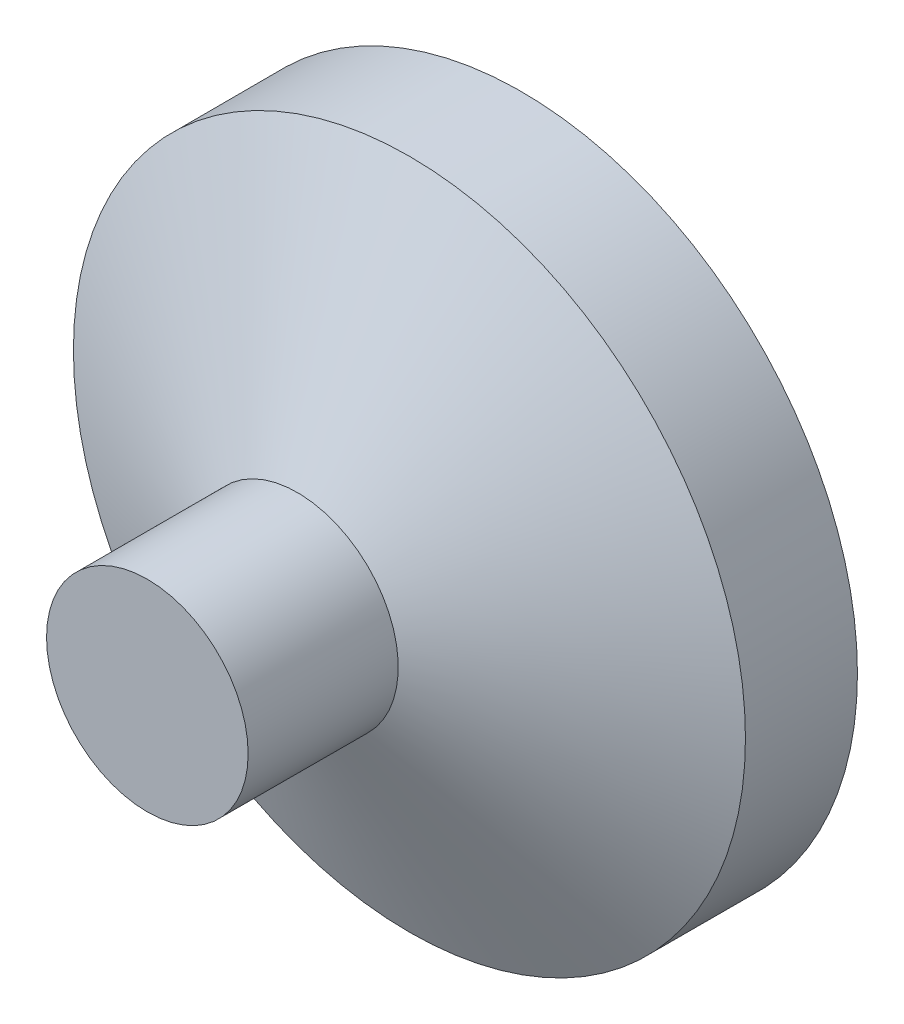
ISO-10303-21;
HEADER;
FILE_DESCRIPTION(('STEP AP214'),'2;1');
FILE_NAME('part.step','',(''),(''),'','','');
FILE_SCHEMA(('AUTOMOTIVE_DESIGN { 1 0 10303 214 1 1 1 1 }'));
ENDSEC;
DATA;
#1=APPLICATION_CONTEXT('core data for automotive mechanical design processes');
#2=APPLICATION_PROTOCOL_DEFINITION('international standard','automotive_design',2000,#1);
#3=PRODUCT_CONTEXT('',#1,'mechanical');
#4=PRODUCT('Part','Part','',(#3));
#5=PRODUCT_RELATED_PRODUCT_CATEGORY('part','',(#4));
#6=PRODUCT_DEFINITION_FORMATION('','',#4);
#7=PRODUCT_DEFINITION_CONTEXT('part definition',#1,'design');
#8=PRODUCT_DEFINITION('design','',#6,#7);
#9=PRODUCT_DEFINITION_SHAPE('','',#8);
#10=(LENGTH_UNIT() NAMED_UNIT(*) SI_UNIT(.MILLI.,.METRE.));
#11=(NAMED_UNIT(*) PLANE_ANGLE_UNIT() SI_UNIT($,.RADIAN.));
#12=(NAMED_UNIT(*) SI_UNIT($,.STERADIAN.) SOLID_ANGLE_UNIT());
#13=UNCERTAINTY_MEASURE_WITH_UNIT(LENGTH_MEASURE(1.E-05),#10,'distance_accuracy_value','');
#14=(GEOMETRIC_REPRESENTATION_CONTEXT(3) GLOBAL_UNCERTAINTY_ASSIGNED_CONTEXT((#13)) GLOBAL_UNIT_ASSIGNED_CONTEXT((#10,
#11,#12)) REPRESENTATION_CONTEXT('',''));
#15=CARTESIAN_POINT('',(0.,0.,0.));
#16=DIRECTION('',(0.,0.,1.));
#17=DIRECTION('',(1.,0.,0.));
#18=AXIS2_PLACEMENT_3D('',#15,#16,#17);
#19=CARTESIAN_POINT('',(0.,0.,-5.));
#20=DIRECTION('',(0.,0.,1.));
#21=DIRECTION('',(1.,0.,0.));
#22=AXIS2_PLACEMENT_3D('',#19,#20,#21);
#23=CYLINDRICAL_SURFACE('',#22,15.);
#24=CARTESIAN_POINT('',(0.,0.,-5.));
#25=DIRECTION('',(0.,0.,1.));
#26=DIRECTION('',(1.,0.,0.));
#27=AXIS2_PLACEMENT_3D('',#24,#25,#26);
#28=CIRCLE('',#27,15.);
#29=CARTESIAN_POINT('',(15.,0.,-5.));
#30=VERTEX_POINT('',#29);
#31=EDGE_CURVE('E11',#30,#30,#28,.T.);
#32=ORIENTED_EDGE('',*,*,#31,.T.);
#33=EDGE_LOOP('',(#32));
#34=FACE_BOUND('',#33,.T.);
#35=CARTESIAN_POINT('',(0.,0.,0.));
#36=DIRECTION('',(0.,0.,-1.));
#37=DIRECTION('',(-1.,0.,0.));
#38=AXIS2_PLACEMENT_3D('',#35,#36,#37);
#39=CIRCLE('',#38,15.);
#40=CARTESIAN_POINT('',(-15.,0.,0.));
#41=VERTEX_POINT('',#40);
#42=EDGE_CURVE('E44',#41,#41,#39,.F.);
#43=ORIENTED_EDGE('',*,*,#42,.F.);
#44=EDGE_LOOP('',(#43));
#45=FACE_BOUND('',#44,.T.);
#46=ADVANCED_FACE('F36',(#34,#45),#23,.T.);
#47=CARTESIAN_POINT('',(0.,0.,-5.));
#48=DIRECTION('',(0.,0.,1.));
#49=DIRECTION('',(1.,0.,0.));
#50=AXIS2_PLACEMENT_3D('',#47,#48,#49);
#51=PLANE('',#50);
#52=CARTESIAN_POINT('',(-8.66025403784439,-5.,-5.));
#53=DIRECTION('',(0.,0.,1.));
#54=DIRECTION('',(1.,0.,0.));
#55=AXIS2_PLACEMENT_3D('',#52,#53,#54);
#56=CIRCLE('',#55,1.);
#57=CARTESIAN_POINT('',(-7.66025403784438,-5.,-5.));
#58=VERTEX_POINT('',#57);
#59=EDGE_CURVE('E91',#58,#58,#56,.T.);
#60=ORIENTED_EDGE('',*,*,#59,.T.);
#61=EDGE_LOOP('',(#60));
#62=FACE_BOUND('',#61,.T.);
#63=CARTESIAN_POINT('',(8.66025403784439,-5.,-5.));
#64=DIRECTION('',(0.,0.,1.));
#65=DIRECTION('',(1.,0.,0.));
#66=AXIS2_PLACEMENT_3D('',#63,#64,#65);
#67=CIRCLE('',#66,1.);
#68=CARTESIAN_POINT('',(9.66025403784439,-5.,-5.));
#69=VERTEX_POINT('',#68);
#70=EDGE_CURVE('E101',#69,#69,#67,.T.);
#71=ORIENTED_EDGE('',*,*,#70,.T.);
#72=EDGE_LOOP('',(#71));
#73=FACE_BOUND('',#72,.T.);
#74=CARTESIAN_POINT('',(0.,10.,-5.));
#75=DIRECTION('',(0.,0.,1.));
#76=DIRECTION('',(1.,0.,0.));
#77=AXIS2_PLACEMENT_3D('',#74,#75,#76);
#78=CIRCLE('',#77,1.);
#79=CARTESIAN_POINT('',(1.,10.,-5.));
#80=VERTEX_POINT('',#79);
#81=EDGE_CURVE('E95',#80,#80,#78,.T.);
#82=ORIENTED_EDGE('',*,*,#81,.T.);
#83=EDGE_LOOP('',(#82));
#84=FACE_BOUND('',#83,.T.);
#85=ORIENTED_EDGE('',*,*,#31,.F.);
#86=EDGE_LOOP('',(#85));
#87=FACE_BOUND('',#86,.T.);
#88=ADVANCED_FACE('F77',(#62,#73,#84,#87),#51,.F.);
#89=CARTESIAN_POINT('',(0.,0.,5.));
#90=DIRECTION('',(0.,0.,-1.));
#91=DIRECTION('',(-1.,0.,0.));
#92=AXIS2_PLACEMENT_3D('',#89,#90,#91);
#93=CONICAL_SURFACE('',#92,4.5,1.1263771168938);
#94=CARTESIAN_POINT('',(0.,0.,5.));
#95=DIRECTION('',(0.,0.,1.));
#96=DIRECTION('',(1.,0.,0.));
#97=AXIS2_PLACEMENT_3D('',#94,#95,#96);
#98=CIRCLE('',#97,4.5);
#99=CARTESIAN_POINT('',(-4.5,0.,5.));
#100=VERTEX_POINT('',#99);
#101=EDGE_CURVE('E39',#100,#100,#98,.T.);
#102=CARTESIAN_POINT('',(-4.5,0.,5.));
#103=CARTESIAN_POINT('',(-4.609375,0.,4.94791666666667));
#104=CARTESIAN_POINT('',(-4.71875,0.,4.89583333333333));
#105=CARTESIAN_POINT('',(-4.9375,0.,4.79166666666667));
#106=CARTESIAN_POINT('',(-5.046875,0.,4.73958333333333));
#107=CARTESIAN_POINT('',(-5.265625,0.,4.63541666666667));
#108=CARTESIAN_POINT('',(-5.375,0.,4.58333333333333));
#109=CARTESIAN_POINT('',(-5.59375,0.,4.47916666666667));
#110=CARTESIAN_POINT('',(-5.703125,0.,4.42708333333333));
#111=CARTESIAN_POINT('',(-5.921875,0.,4.32291666666667));
#112=CARTESIAN_POINT('',(-6.03125,0.,4.27083333333333));
#113=CARTESIAN_POINT('',(-6.25,0.,4.16666666666667));
#114=CARTESIAN_POINT('',(-6.359375,0.,4.11458333333333));
#115=CARTESIAN_POINT('',(-6.578125,0.,4.01041666666667));
#116=CARTESIAN_POINT('',(-6.6875,0.,3.95833333333333));
#117=CARTESIAN_POINT('',(-6.90625,0.,3.85416666666667));
#118=CARTESIAN_POINT('',(-7.015625,0.,3.80208333333333));
#119=CARTESIAN_POINT('',(-7.234375,0.,3.69791666666667));
#120=CARTESIAN_POINT('',(-7.34375,0.,3.64583333333333));
#121=CARTESIAN_POINT('',(-7.5625,0.,3.54166666666667));
#122=CARTESIAN_POINT('',(-7.671875,0.,3.48958333333333));
#123=CARTESIAN_POINT('',(-7.890625,0.,3.38541666666667));
#124=CARTESIAN_POINT('',(-8.,0.,3.33333333333333));
#125=CARTESIAN_POINT('',(-8.21875,0.,3.22916666666667));
#126=CARTESIAN_POINT('',(-8.328125,0.,3.17708333333333));
#127=CARTESIAN_POINT('',(-8.546875,0.,3.07291666666667));
#128=CARTESIAN_POINT('',(-8.65625,0.,3.02083333333333));
#129=CARTESIAN_POINT('',(-8.875,0.,2.91666666666667));
#130=CARTESIAN_POINT('',(-8.984375,0.,2.86458333333333));
#131=CARTESIAN_POINT('',(-9.203125,0.,2.76041666666667));
#132=CARTESIAN_POINT('',(-9.3125,0.,2.70833333333333));
#133=CARTESIAN_POINT('',(-9.53125,0.,2.60416666666667));
#134=CARTESIAN_POINT('',(-9.640625,0.,2.55208333333333));
#135=CARTESIAN_POINT('',(-9.859375,0.,2.44791666666667));
#136=CARTESIAN_POINT('',(-9.96875,0.,2.39583333333333));
#137=CARTESIAN_POINT('',(-10.1875,0.,2.29166666666667));
#138=CARTESIAN_POINT('',(-10.296875,0.,2.23958333333333));
#139=CARTESIAN_POINT('',(-10.515625,0.,2.13541666666667));
#140=CARTESIAN_POINT('',(-10.625,0.,2.08333333333333));
#141=CARTESIAN_POINT('',(-10.84375,0.,1.97916666666667));
#142=CARTESIAN_POINT('',(-10.953125,0.,1.92708333333333));
#143=CARTESIAN_POINT('',(-11.171875,0.,1.82291666666667));
#144=CARTESIAN_POINT('',(-11.28125,0.,1.77083333333333));
#145=CARTESIAN_POINT('',(-11.5,0.,1.66666666666667));
#146=CARTESIAN_POINT('',(-11.609375,0.,1.61458333333333));
#147=CARTESIAN_POINT('',(-11.828125,0.,1.51041666666667));
#148=CARTESIAN_POINT('',(-11.9375,0.,1.45833333333333));
#149=CARTESIAN_POINT('',(-12.15625,0.,1.35416666666667));
#150=CARTESIAN_POINT('',(-12.265625,0.,1.30208333333333));
#151=CARTESIAN_POINT('',(-12.484375,0.,1.19791666666667));
#152=CARTESIAN_POINT('',(-12.59375,0.,1.14583333333333));
#153=CARTESIAN_POINT('',(-12.8125,0.,1.04166666666667));
#154=CARTESIAN_POINT('',(-12.921875,0.,0.989583333333334));
#155=CARTESIAN_POINT('',(-13.140625,0.,0.885416666666668));
#156=CARTESIAN_POINT('',(-13.25,0.,0.833333333333334));
#157=CARTESIAN_POINT('',(-13.46875,0.,0.729166666666667));
#158=CARTESIAN_POINT('',(-13.578125,0.,0.677083333333334));
#159=CARTESIAN_POINT('',(-13.796875,0.,0.572916666666667));
#160=CARTESIAN_POINT('',(-13.90625,0.,0.520833333333334));
#161=CARTESIAN_POINT('',(-14.125,0.,0.416666666666667));
#162=CARTESIAN_POINT('',(-14.234375,0.,0.364583333333334));
#163=CARTESIAN_POINT('',(-14.453125,0.,0.260416666666668));
#164=CARTESIAN_POINT('',(-14.5625,0.,0.208333333333334));
#165=CARTESIAN_POINT('',(-14.78125,0.,0.104166666666668));
#166=CARTESIAN_POINT('',(-14.890625,0.,0.0520833333333347));
#167=CARTESIAN_POINT('',(-15.,0.,0.));
#168=B_SPLINE_CURVE_WITH_KNOTS('',3,(#102,#103,#104,#105,#106,#107,#108,#109,#110,#111,#112,
#113,#114,#115,#116,#117,#118,#119,#120,#121,#122,#123,#124,#125,#126,#127,#128,#129,#130,#131,
#132,#133,#134,#135,#136,#137,#138,#139,#140,#141,#142,#143,#144,#145,#146,#147,#148,#149,#150,
#151,#152,#153,#154,#155,#156,#157,#158,#159,#160,#161,#162,#163,#164,#165,#166,#167),
.UNSPECIFIED.,.F.,.F.,(4,2,2,2,2,2,2,2,2,2,2,2,2,2,2,2,2,2,2,2,2,2,2,2,2,2,2,2,2,2,2,2,4),(0.,
0.363428229675406,0.726856459350812,1.09028468902622,1.45371291870163,1.81714114837703,
2.18056937805244,2.54399760772784,2.90742583740325,3.27085406707866,3.63428229675406,
3.99771052642947,4.36113875610488,4.72456698578028,5.08799521545569,5.4514234451311,
5.8148516748065,6.17827990448191,6.54170813415731,6.90513636383272,7.26856459350813,
7.63199282318354,7.99542105285894,8.35884928253435,8.72227751220975,9.08570574188516,
9.44913397156057,9.81256220123597,10.1759904309114,10.5394186605868,10.9028468902622,
11.2662751199376,11.629703349613),.UNSPECIFIED.);
#169=EDGE_CURVE('BSEAM72',#100,#41,#168,.T.);
#170=ORIENTED_EDGE('',*,*,#101,.F.);
#171=ORIENTED_EDGE('',*,*,#42,.T.);
#172=ORIENTED_EDGE('',*,*,#169,.T.);
#173=ORIENTED_EDGE('',*,*,#169,.F.);
#174=EDGE_LOOP('',(#170,#172,#171,#173));
#175=FACE_BOUND('',#174,.T.);
#176=ADVANCED_FACE('F72',(#175),#93,.T.);
#177=CARTESIAN_POINT('',(0.,0.,11.7));
#178=DIRECTION('',(0.,0.,-1.));
#179=DIRECTION('',(-1.,0.,0.));
#180=AXIS2_PLACEMENT_3D('',#177,#178,#179);
#181=CYLINDRICAL_SURFACE('',#180,4.5);
#182=CARTESIAN_POINT('',(0.,0.,11.7));
#183=DIRECTION('',(0.,0.,1.));
#184=DIRECTION('',(1.,0.,0.));
#185=AXIS2_PLACEMENT_3D('',#182,#183,#184);
#186=CIRCLE('',#185,4.5);
#187=CARTESIAN_POINT('',(4.5,0.,11.7));
#188=VERTEX_POINT('',#187);
#189=EDGE_CURVE('E88',#188,#188,#186,.T.);
#190=ORIENTED_EDGE('',*,*,#189,.F.);
#191=EDGE_LOOP('',(#190));
#192=FACE_BOUND('',#191,.T.);
#193=ORIENTED_EDGE('',*,*,#101,.T.);
#194=EDGE_LOOP('',(#193));
#195=FACE_BOUND('',#194,.T.);
#196=ADVANCED_FACE('F61',(#192,#195),#181,.T.);
#197=CARTESIAN_POINT('',(0.,0.,11.7));
#198=DIRECTION('',(0.,0.,1.));
#199=DIRECTION('',(1.,0.,0.));
#200=AXIS2_PLACEMENT_3D('',#197,#198,#199);
#201=PLANE('',#200);
#202=ORIENTED_EDGE('',*,*,#189,.T.);
#203=EDGE_LOOP('',(#202));
#204=FACE_BOUND('',#203,.T.);
#205=ADVANCED_FACE('F71',(#204),#201,.T.);
#206=CARTESIAN_POINT('',(0.,10.,-5.));
#207=DIRECTION('',(0.,0.,1.));
#208=DIRECTION('',(1.,0.,0.));
#209=AXIS2_PLACEMENT_3D('',#206,#207,#208);
#210=CYLINDRICAL_SURFACE('',#209,1.);
#211=ORIENTED_EDGE('',*,*,#81,.F.);
#212=EDGE_LOOP('',(#211));
#213=FACE_BOUND('',#212,.T.);
#214=CARTESIAN_POINT('',(0.,10.,0.));
#215=DIRECTION('',(0.,0.,1.));
#216=DIRECTION('',(1.,0.,0.));
#217=AXIS2_PLACEMENT_3D('',#214,#215,#216);
#218=CIRCLE('',#217,1.);
#219=CARTESIAN_POINT('',(1.,10.,0.));
#220=VERTEX_POINT('',#219);
#221=EDGE_CURVE('E92',#220,#220,#218,.T.);
#222=ORIENTED_EDGE('',*,*,#221,.T.);
#223=EDGE_LOOP('',(#222));
#224=FACE_BOUND('',#223,.T.);
#225=ADVANCED_FACE('F148',(#213,#224),#210,.F.);
#226=CARTESIAN_POINT('',(0.,10.,0.));
#227=DIRECTION('',(0.,0.,1.));
#228=DIRECTION('',(1.,0.,0.));
#229=AXIS2_PLACEMENT_3D('',#226,#227,#228);
#230=PLANE('',#229);
#231=ORIENTED_EDGE('',*,*,#221,.F.);
#232=EDGE_LOOP('',(#231));
#233=FACE_BOUND('',#232,.T.);
#234=ADVANCED_FACE('F154',(#233),#230,.F.);
#235=CARTESIAN_POINT('',(8.66025403784439,-5.,-5.));
#236=DIRECTION('',(0.,0.,1.));
#237=DIRECTION('',(1.,0.,0.));
#238=AXIS2_PLACEMENT_3D('',#235,#236,#237);
#239=CYLINDRICAL_SURFACE('',#238,1.);
#240=ORIENTED_EDGE('',*,*,#70,.F.);
#241=EDGE_LOOP('',(#240));
#242=FACE_BOUND('',#241,.T.);
#243=CARTESIAN_POINT('',(8.66025403784439,-5.,0.));
#244=DIRECTION('',(0.,0.,1.));
#245=DIRECTION('',(1.,0.,0.));
#246=AXIS2_PLACEMENT_3D('',#243,#244,#245);
#247=CIRCLE('',#246,1.);
#248=CARTESIAN_POINT('',(9.66025403784439,-5.,0.));
#249=VERTEX_POINT('',#248);
#250=EDGE_CURVE('E98',#249,#249,#247,.T.);
#251=ORIENTED_EDGE('',*,*,#250,.T.);
#252=EDGE_LOOP('',(#251));
#253=FACE_BOUND('',#252,.T.);
#254=ADVANCED_FACE('F161',(#242,#253),#239,.F.);
#255=CARTESIAN_POINT('',(8.66025403784439,-5.,0.));
#256=DIRECTION('',(0.,0.,1.));
#257=DIRECTION('',(1.,0.,0.));
#258=AXIS2_PLACEMENT_3D('',#255,#256,#257);
#259=PLANE('',#258);
#260=ORIENTED_EDGE('',*,*,#250,.F.);
#261=EDGE_LOOP('',(#260));
#262=FACE_BOUND('',#261,.T.);
#263=ADVANCED_FACE('F116',(#262),#259,.F.);
#264=CARTESIAN_POINT('',(-8.66025403784439,-5.,-5.));
#265=DIRECTION('',(0.,0.,1.));
#266=DIRECTION('',(1.,0.,0.));
#267=AXIS2_PLACEMENT_3D('',#264,#265,#266);
#268=CYLINDRICAL_SURFACE('',#267,1.);
#269=ORIENTED_EDGE('',*,*,#59,.F.);
#270=EDGE_LOOP('',(#269));
#271=FACE_BOUND('',#270,.T.);
#272=CARTESIAN_POINT('',(-8.66025403784439,-5.,0.));
#273=DIRECTION('',(0.,0.,1.));
#274=DIRECTION('',(1.,0.,0.));
#275=AXIS2_PLACEMENT_3D('',#272,#273,#274);
#276=CIRCLE('',#275,1.);
#277=CARTESIAN_POINT('',(-7.66025403784438,-5.,0.));
#278=VERTEX_POINT('',#277);
#279=EDGE_CURVE('E104',#278,#278,#276,.T.);
#280=ORIENTED_EDGE('',*,*,#279,.T.);
#281=EDGE_LOOP('',(#280));
#282=FACE_BOUND('',#281,.T.);
#283=ADVANCED_FACE('F112',(#271,#282),#268,.F.);
#284=CARTESIAN_POINT('',(-8.66025403784439,-5.,0.));
#285=DIRECTION('',(0.,0.,1.));
#286=DIRECTION('',(1.,0.,0.));
#287=AXIS2_PLACEMENT_3D('',#284,#285,#286);
#288=PLANE('',#287);
#289=ORIENTED_EDGE('',*,*,#279,.F.);
#290=EDGE_LOOP('',(#289));
#291=FACE_BOUND('',#290,.T.);
#292=ADVANCED_FACE('F115',(#291),#288,.F.);
#293=CLOSED_SHELL('',(#46,#88,#176,#196,#205,#225,#234,#254,#263,#283,#292));
#294=MANIFOLD_SOLID_BREP('B2',#293);
#295=ADVANCED_BREP_SHAPE_REPRESENTATION('',(#18,#294),#14);
#296=SHAPE_DEFINITION_REPRESENTATION(#9,#295);
ENDSEC;
END-ISO-10303-21;
